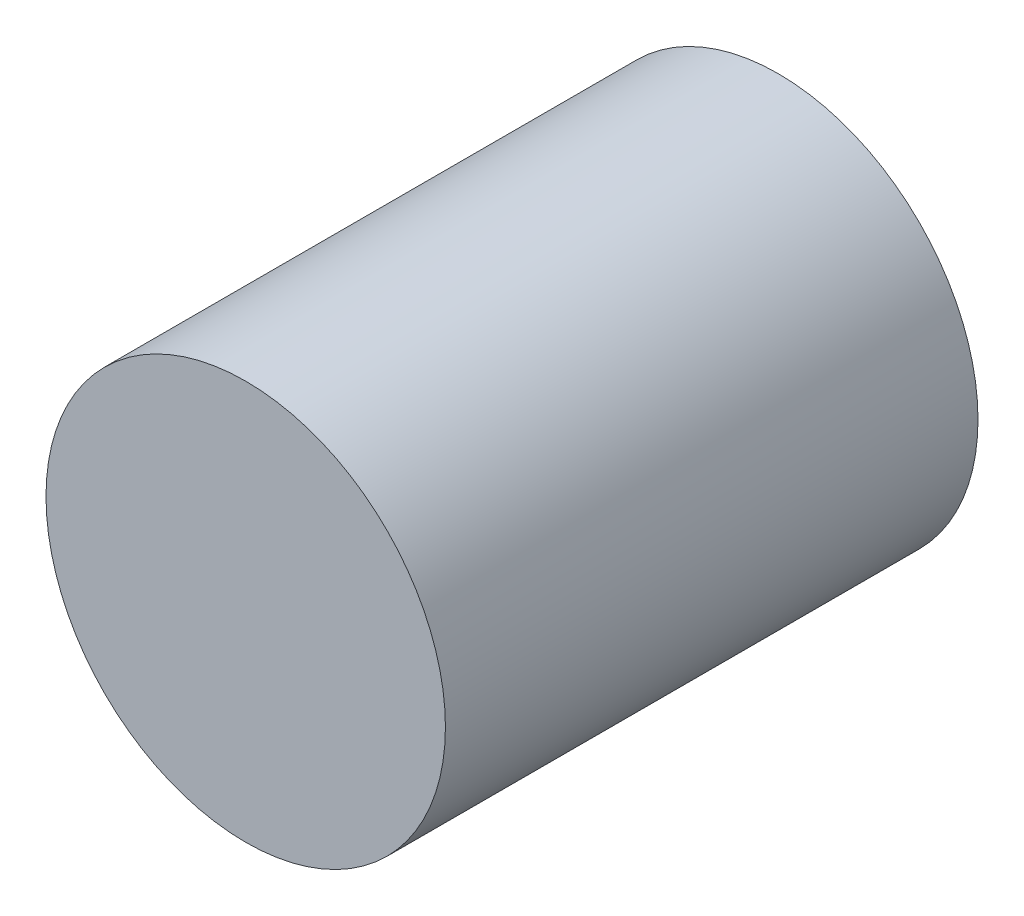
ISO-10303-21;
HEADER;
FILE_DESCRIPTION(('STEP AP214'),'2;1');
FILE_NAME('part.step','',(''),(''),'','','');
FILE_SCHEMA(('AUTOMOTIVE_DESIGN { 1 0 10303 214 1 1 1 1 }'));
ENDSEC;
DATA;
#1=APPLICATION_CONTEXT('core data for automotive mechanical design processes');
#2=APPLICATION_PROTOCOL_DEFINITION('international standard','automotive_design',2000,#1);
#3=PRODUCT_CONTEXT('',#1,'mechanical');
#4=PRODUCT('Part','Part','',(#3));
#5=PRODUCT_RELATED_PRODUCT_CATEGORY('part','',(#4));
#6=PRODUCT_DEFINITION_FORMATION('','',#4);
#7=PRODUCT_DEFINITION_CONTEXT('part definition',#1,'design');
#8=PRODUCT_DEFINITION('design','',#6,#7);
#9=PRODUCT_DEFINITION_SHAPE('','',#8);
#10=(LENGTH_UNIT() NAMED_UNIT(*) SI_UNIT(.MILLI.,.METRE.));
#11=(NAMED_UNIT(*) PLANE_ANGLE_UNIT() SI_UNIT($,.RADIAN.));
#12=(NAMED_UNIT(*) SI_UNIT($,.STERADIAN.) SOLID_ANGLE_UNIT());
#13=UNCERTAINTY_MEASURE_WITH_UNIT(LENGTH_MEASURE(1.E-05),#10,'distance_accuracy_value','');
#14=(GEOMETRIC_REPRESENTATION_CONTEXT(3) GLOBAL_UNCERTAINTY_ASSIGNED_CONTEXT((#13)) GLOBAL_UNIT_ASSIGNED_CONTEXT((#10,
#11,#12)) REPRESENTATION_CONTEXT('',''));
#15=CARTESIAN_POINT('',(0.,0.,0.));
#16=DIRECTION('',(0.,0.,1.));
#17=DIRECTION('',(1.,0.,0.));
#18=AXIS2_PLACEMENT_3D('',#15,#16,#17);
#19=CARTESIAN_POINT('',(0.,0.,30.));
#20=DIRECTION('',(0.,0.,-1.));
#21=DIRECTION('',(-1.,0.,0.));
#22=AXIS2_PLACEMENT_3D('',#19,#20,#21);
#23=CYLINDRICAL_SURFACE('',#22,22.5);
#24=CARTESIAN_POINT('',(0.,0.,30.));
#25=DIRECTION('',(0.,0.,1.));
#26=DIRECTION('',(1.,0.,0.));
#27=AXIS2_PLACEMENT_3D('',#24,#25,#26);
#28=CIRCLE('',#27,22.5);
#29=CARTESIAN_POINT('',(22.5,0.,30.));
#30=VERTEX_POINT('',#29);
#31=EDGE_CURVE('E10',#30,#30,#28,.T.);
#32=ORIENTED_EDGE('',*,*,#31,.F.);
#33=EDGE_LOOP('',(#32));
#34=FACE_BOUND('',#33,.T.);
#35=CARTESIAN_POINT('',(0.,0.,-30.));
#36=DIRECTION('',(0.,0.,1.));
#37=DIRECTION('',(1.,0.,0.));
#38=AXIS2_PLACEMENT_3D('',#35,#36,#37);
#39=CIRCLE('',#38,22.5);
#40=CARTESIAN_POINT('',(22.5,0.,-30.));
#41=VERTEX_POINT('',#40);
#42=EDGE_CURVE('E34',#41,#41,#39,.T.);
#43=ORIENTED_EDGE('',*,*,#42,.T.);
#44=EDGE_LOOP('',(#43));
#45=FACE_BOUND('',#44,.T.);
#46=ADVANCED_FACE('F31',(#34,#45),#23,.T.);
#47=CARTESIAN_POINT('',(0.,0.,30.));
#48=DIRECTION('',(0.,0.,1.));
#49=DIRECTION('',(1.,0.,0.));
#50=AXIS2_PLACEMENT_3D('',#47,#48,#49);
#51=PLANE('',#50);
#52=ORIENTED_EDGE('',*,*,#31,.T.);
#53=EDGE_LOOP('',(#52));
#54=FACE_BOUND('',#53,.T.);
#55=ADVANCED_FACE('F46',(#54),#51,.T.);
#56=CARTESIAN_POINT('',(0.,0.,-30.));
#57=DIRECTION('',(0.,0.,1.));
#58=DIRECTION('',(1.,0.,0.));
#59=AXIS2_PLACEMENT_3D('',#56,#57,#58);
#60=PLANE('',#59);
#61=ORIENTED_EDGE('',*,*,#42,.F.);
#62=EDGE_LOOP('',(#61));
#63=FACE_BOUND('',#62,.T.);
#64=ADVANCED_FACE('F44',(#63),#60,.F.);
#65=CLOSED_SHELL('',(#46,#55,#64));
#66=MANIFOLD_SOLID_BREP('B2',#65);
#67=ADVANCED_BREP_SHAPE_REPRESENTATION('',(#18,#66),#14);
#68=SHAPE_DEFINITION_REPRESENTATION(#9,#67);
ENDSEC;
END-ISO-10303-21;
